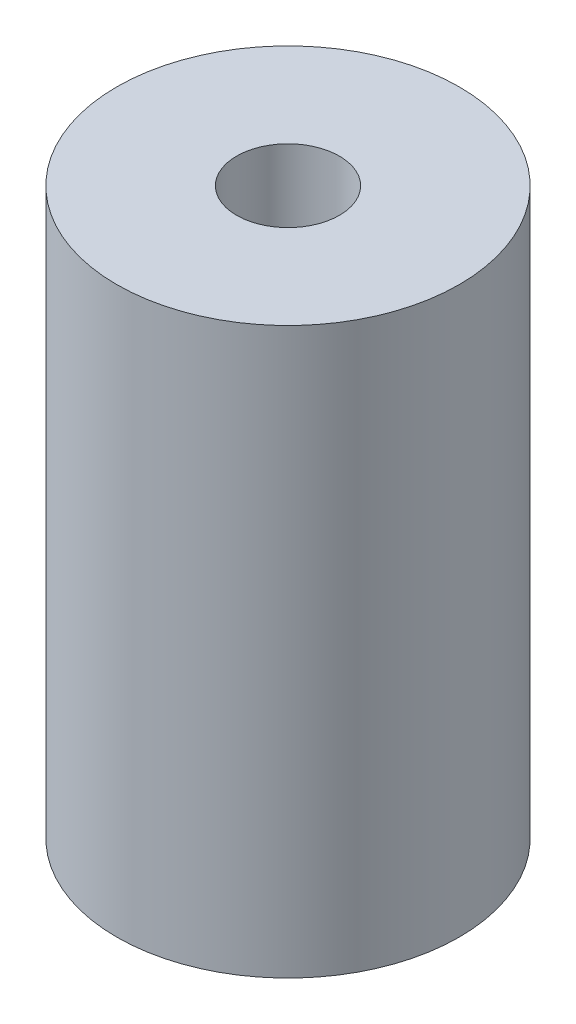
ISO-10303-21;
HEADER;
FILE_DESCRIPTION(('STEP AP214'),'2;1');
FILE_NAME('part.step','',(''),(''),'','','');
FILE_SCHEMA(('AUTOMOTIVE_DESIGN { 1 0 10303 214 1 1 1 1 }'));
ENDSEC;
DATA;
#1=APPLICATION_CONTEXT('core data for automotive mechanical design processes');
#2=APPLICATION_PROTOCOL_DEFINITION('international standard','automotive_design',2000,#1);
#3=PRODUCT_CONTEXT('',#1,'mechanical');
#4=PRODUCT('Part','Part','',(#3));
#5=PRODUCT_RELATED_PRODUCT_CATEGORY('part','',(#4));
#6=PRODUCT_DEFINITION_FORMATION('','',#4);
#7=PRODUCT_DEFINITION_CONTEXT('part definition',#1,'design');
#8=PRODUCT_DEFINITION('design','',#6,#7);
#9=PRODUCT_DEFINITION_SHAPE('','',#8);
#10=(LENGTH_UNIT() NAMED_UNIT(*) SI_UNIT(.MILLI.,.METRE.));
#11=(NAMED_UNIT(*) PLANE_ANGLE_UNIT() SI_UNIT($,.RADIAN.));
#12=(NAMED_UNIT(*) SI_UNIT($,.STERADIAN.) SOLID_ANGLE_UNIT());
#13=UNCERTAINTY_MEASURE_WITH_UNIT(LENGTH_MEASURE(1.E-05),#10,'distance_accuracy_value','');
#14=(GEOMETRIC_REPRESENTATION_CONTEXT(3) GLOBAL_UNCERTAINTY_ASSIGNED_CONTEXT((#13)) GLOBAL_UNIT_ASSIGNED_CONTEXT((#10,
#11,#12)) REPRESENTATION_CONTEXT('',''));
#15=CARTESIAN_POINT('',(0.,0.,0.));
#16=DIRECTION('',(0.,0.,1.));
#17=DIRECTION('',(1.,0.,0.));
#18=AXIS2_PLACEMENT_3D('',#15,#16,#17);
#19=CARTESIAN_POINT('',(0.,16.5,0.));
#20=DIRECTION('',(0.,1.,0.));
#21=DIRECTION('',(0.,0.,1.));
#22=AXIS2_PLACEMENT_3D('',#19,#20,#21);
#23=PLANE('',#22);
#24=CARTESIAN_POINT('',(0.,16.5,0.));
#25=DIRECTION('',(0.,1.,0.));
#26=DIRECTION('',(0.,0.,1.));
#27=AXIS2_PLACEMENT_3D('',#24,#25,#26);
#28=CIRCLE('',#27,5.);
#29=CARTESIAN_POINT('',(0.,16.5,5.));
#30=VERTEX_POINT('',#29);
#31=EDGE_CURVE('E10',#30,#30,#28,.T.);
#32=ORIENTED_EDGE('',*,*,#31,.T.);
#33=EDGE_LOOP('',(#32));
#34=FACE_BOUND('',#33,.T.);
#35=CARTESIAN_POINT('',(0.,16.5,0.));
#36=DIRECTION('',(0.,1.,0.));
#37=DIRECTION('',(0.,0.,1.));
#38=AXIS2_PLACEMENT_3D('',#35,#36,#37);
#39=CIRCLE('',#38,1.5);
#40=CARTESIAN_POINT('',(0.,16.5,1.5));
#41=VERTEX_POINT('',#40);
#42=EDGE_CURVE('E50',#41,#41,#39,.T.);
#43=ORIENTED_EDGE('',*,*,#42,.F.);
#44=EDGE_LOOP('',(#43));
#45=FACE_BOUND('',#44,.T.);
#46=ADVANCED_FACE('F39',(#34,#45),#23,.T.);
#47=CARTESIAN_POINT('',(0.,0.,0.));
#48=DIRECTION('',(0.,1.,0.));
#49=DIRECTION('',(0.,0.,1.));
#50=AXIS2_PLACEMENT_3D('',#47,#48,#49);
#51=PLANE('',#50);
#52=CARTESIAN_POINT('',(0.,0.,0.));
#53=DIRECTION('',(0.,1.,0.));
#54=DIRECTION('',(0.,0.,1.));
#55=AXIS2_PLACEMENT_3D('',#52,#53,#54);
#56=CIRCLE('',#55,5.);
#57=CARTESIAN_POINT('',(0.,0.,5.));
#58=VERTEX_POINT('',#57);
#59=EDGE_CURVE('E43',#58,#58,#56,.T.);
#60=ORIENTED_EDGE('',*,*,#59,.F.);
#61=EDGE_LOOP('',(#60));
#62=FACE_BOUND('',#61,.T.);
#63=CARTESIAN_POINT('',(0.,0.,0.));
#64=DIRECTION('',(0.,1.,0.));
#65=DIRECTION('',(0.,0.,1.));
#66=AXIS2_PLACEMENT_3D('',#63,#64,#65);
#67=CIRCLE('',#66,1.5);
#68=CARTESIAN_POINT('',(0.,0.,1.5));
#69=VERTEX_POINT('',#68);
#70=EDGE_CURVE('E52',#69,#69,#67,.T.);
#71=ORIENTED_EDGE('',*,*,#70,.T.);
#72=EDGE_LOOP('',(#71));
#73=FACE_BOUND('',#72,.T.);
#74=ADVANCED_FACE('F62',(#62,#73),#51,.F.);
#75=CARTESIAN_POINT('',(0.,16.5,0.));
#76=DIRECTION('',(0.,-1.,0.));
#77=DIRECTION('',(0.,0.,-1.));
#78=AXIS2_PLACEMENT_3D('',#75,#76,#77);
#79=CYLINDRICAL_SURFACE('',#78,5.);
#80=ORIENTED_EDGE('',*,*,#31,.F.);
#81=EDGE_LOOP('',(#80));
#82=FACE_BOUND('',#81,.T.);
#83=ORIENTED_EDGE('',*,*,#59,.T.);
#84=EDGE_LOOP('',(#83));
#85=FACE_BOUND('',#84,.T.);
#86=ADVANCED_FACE('F41',(#82,#85),#79,.T.);
#87=CARTESIAN_POINT('',(0.,16.5,0.));
#88=DIRECTION('',(0.,-1.,0.));
#89=DIRECTION('',(0.,0.,-1.));
#90=AXIS2_PLACEMENT_3D('',#87,#88,#89);
#91=CYLINDRICAL_SURFACE('',#90,1.5);
#92=ORIENTED_EDGE('',*,*,#42,.T.);
#93=EDGE_LOOP('',(#92));
#94=FACE_BOUND('',#93,.T.);
#95=ORIENTED_EDGE('',*,*,#70,.F.);
#96=EDGE_LOOP('',(#95));
#97=FACE_BOUND('',#96,.T.);
#98=ADVANCED_FACE('F58',(#94,#97),#91,.F.);
#99=CLOSED_SHELL('',(#46,#74,#86,#98));
#100=MANIFOLD_SOLID_BREP('B2',#99);
#101=ADVANCED_BREP_SHAPE_REPRESENTATION('',(#18,#100),#14);
#102=SHAPE_DEFINITION_REPRESENTATION(#9,#101);
ENDSEC;
END-ISO-10303-21;
